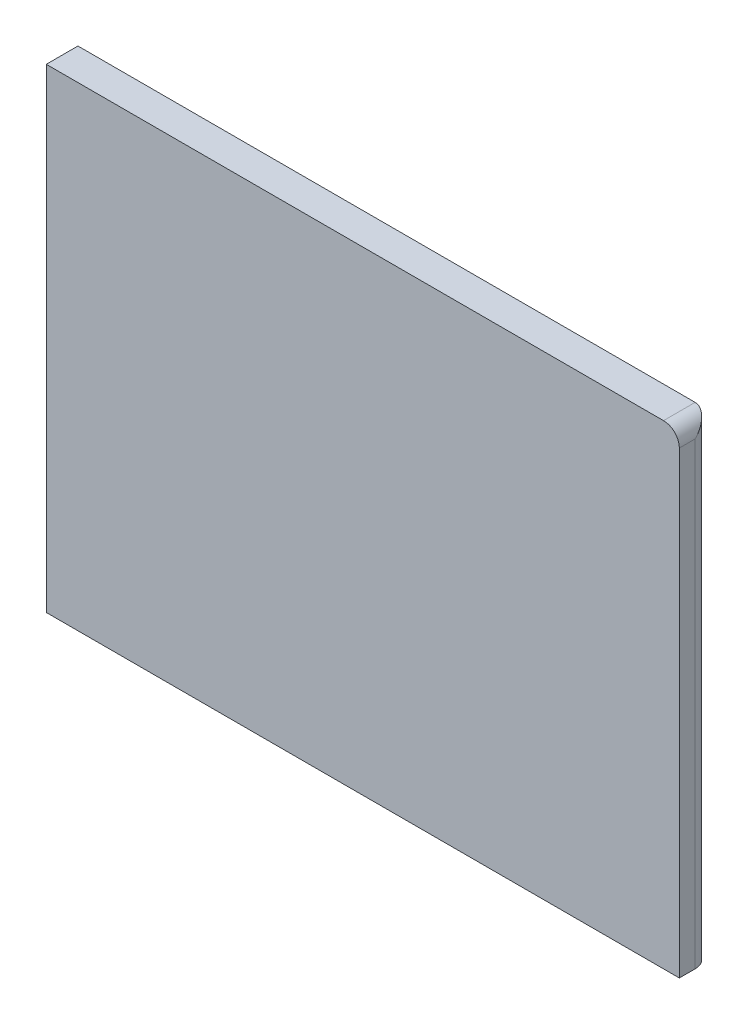
ISO-10303-21;
HEADER;
FILE_DESCRIPTION(('STEP AP214'),'2;1');
FILE_NAME('part.step','',(''),(''),'','','');
FILE_SCHEMA(('AUTOMOTIVE_DESIGN { 1 0 10303 214 1 1 1 1 }'));
ENDSEC;
DATA;
#1=APPLICATION_CONTEXT('core data for automotive mechanical design processes');
#2=APPLICATION_PROTOCOL_DEFINITION('international standard','automotive_design',2000,#1);
#3=PRODUCT_CONTEXT('',#1,'mechanical');
#4=PRODUCT('Part','Part','',(#3));
#5=PRODUCT_RELATED_PRODUCT_CATEGORY('part','',(#4));
#6=PRODUCT_DEFINITION_FORMATION('','',#4);
#7=PRODUCT_DEFINITION_CONTEXT('part definition',#1,'design');
#8=PRODUCT_DEFINITION('design','',#6,#7);
#9=PRODUCT_DEFINITION_SHAPE('','',#8);
#10=(LENGTH_UNIT() NAMED_UNIT(*) SI_UNIT(.MILLI.,.METRE.));
#11=(NAMED_UNIT(*) PLANE_ANGLE_UNIT() SI_UNIT($,.RADIAN.));
#12=(NAMED_UNIT(*) SI_UNIT($,.STERADIAN.) SOLID_ANGLE_UNIT());
#13=UNCERTAINTY_MEASURE_WITH_UNIT(LENGTH_MEASURE(1.E-05),#10,'distance_accuracy_value','');
#14=(GEOMETRIC_REPRESENTATION_CONTEXT(3) GLOBAL_UNCERTAINTY_ASSIGNED_CONTEXT((#13)) GLOBAL_UNIT_ASSIGNED_CONTEXT((#10,
#11,#12)) REPRESENTATION_CONTEXT('',''));
#15=CARTESIAN_POINT('',(0.,0.,0.));
#16=DIRECTION('',(0.,0.,1.));
#17=DIRECTION('',(1.,0.,0.));
#18=AXIS2_PLACEMENT_3D('',#15,#16,#17);
#19=CARTESIAN_POINT('',(80.,0.,-110.));
#20=DIRECTION('',(0.,0.,-1.));
#21=DIRECTION('',(0.,1.,0.));
#22=AXIS2_PLACEMENT_3D('',#19,#20,#21);
#23=PLANE('',#22);
#24=DIRECTION('',(1.,0.,0.));
#25=VECTOR('',#24,1.);
#26=CARTESIAN_POINT('',(0.,78.,-110.));
#27=LINE('',#26,#25);
#28=CARTESIAN_POINT('',(40.,78.,-110.));
#29=VERTEX_POINT('',#28);
#30=CARTESIAN_POINT('',(79.,78.,-110.));
#31=VERTEX_POINT('',#30);
#32=EDGE_CURVE('E72',#29,#31,#27,.T.);
#33=ORIENTED_EDGE('',*,*,#32,.F.);
#34=DIRECTION('',(0.,-1.,0.));
#35=VECTOR('',#34,1.);
#36=CARTESIAN_POINT('',(40.,0.,-110.));
#37=LINE('',#36,#35);
#38=CARTESIAN_POINT('',(40.,108.,-110.));
#39=VERTEX_POINT('',#38);
#40=EDGE_CURVE('E109',#39,#29,#37,.T.);
#41=ORIENTED_EDGE('',*,*,#40,.F.);
#42=DIRECTION('',(-1.,0.,0.));
#43=VECTOR('',#42,1.);
#44=CARTESIAN_POINT('',(80.,108.,-110.));
#45=LINE('',#44,#43);
#46=CARTESIAN_POINT('',(79.,108.,-110.));
#47=VERTEX_POINT('',#46);
#48=EDGE_CURVE('E143',#47,#39,#45,.T.);
#49=ORIENTED_EDGE('',*,*,#48,.F.);
#50=DIRECTION('',(0.,-1.,0.));
#51=VECTOR('',#50,1.);
#52=CARTESIAN_POINT('',(79.,0.,-110.));
#53=LINE('',#52,#51);
#54=EDGE_CURVE('E125',#47,#31,#53,.T.);
#55=ORIENTED_EDGE('',*,*,#54,.T.);
#56=EDGE_LOOP('',(#33,#41,#49,#55));
#57=FACE_BOUND('',#56,.T.);
#58=ADVANCED_FACE('F57',(#57),#23,.T.);
#59=CARTESIAN_POINT('',(80.,108.000000000001,-7.49400541621985E-13));
#60=DIRECTION('',(0.,1.,0.));
#61=DIRECTION('',(0.,0.,1.));
#62=AXIS2_PLACEMENT_3D('',#59,#60,#61);
#63=PLANE('',#62);
#64=ORIENTED_EDGE('',*,*,#48,.T.);
#65=DIRECTION('',(0.,0.,1.));
#66=VECTOR('',#65,1.);
#67=CARTESIAN_POINT('',(40.,108.,-110.));
#68=LINE('',#67,#66);
#69=CARTESIAN_POINT('',(40.,108.,-108.));
#70=VERTEX_POINT('',#69);
#71=EDGE_CURVE('E113',#39,#70,#68,.T.);
#72=ORIENTED_EDGE('',*,*,#71,.T.);
#73=DIRECTION('',(-1.,0.,0.));
#74=VECTOR('',#73,1.);
#75=CARTESIAN_POINT('',(80.,108.,-108.));
#76=LINE('',#75,#74);
#77=CARTESIAN_POINT('',(79.,108.,-108.));
#78=VERTEX_POINT('',#77);
#79=EDGE_CURVE('E141',#78,#70,#76,.T.);
#80=ORIENTED_EDGE('',*,*,#79,.F.);
#81=DIRECTION('',(0.,0.,-1.));
#82=VECTOR('',#81,1.);
#83=CARTESIAN_POINT('',(79.,108.000000000001,-7.49400541621985E-13));
#84=LINE('',#83,#82);
#85=EDGE_CURVE('E151',#78,#47,#84,.T.);
#86=ORIENTED_EDGE('',*,*,#85,.T.);
#87=EDGE_LOOP('',(#64,#72,#80,#86));
#88=FACE_BOUND('',#87,.T.);
#89=ADVANCED_FACE('F165',(#88),#63,.T.);
#90=CARTESIAN_POINT('',(80.,0.,-108.));
#91=DIRECTION('',(0.,0.,1.));
#92=DIRECTION('',(1.,0.,0.));
#93=AXIS2_PLACEMENT_3D('',#90,#91,#92);
#94=PLANE('',#93);
#95=ORIENTED_EDGE('',*,*,#79,.T.);
#96=DIRECTION('',(0.,-1.,0.));
#97=VECTOR('',#96,1.);
#98=CARTESIAN_POINT('',(40.,0.,-108.));
#99=LINE('',#98,#97);
#100=CARTESIAN_POINT('',(40.,78.,-108.));
#101=VERTEX_POINT('',#100);
#102=EDGE_CURVE('E12',#70,#101,#99,.T.);
#103=ORIENTED_EDGE('',*,*,#102,.T.);
#104=DIRECTION('',(1.,0.,0.));
#105=VECTOR('',#104,1.);
#106=CARTESIAN_POINT('',(80.,78.,-108.));
#107=LINE('',#106,#105);
#108=CARTESIAN_POINT('',(80.,78.,-108.));
#109=VERTEX_POINT('',#108);
#110=EDGE_CURVE('E121',#101,#109,#107,.T.);
#111=ORIENTED_EDGE('',*,*,#110,.T.);
#112=DIRECTION('',(0.,1.,0.));
#113=VECTOR('',#112,1.);
#114=CARTESIAN_POINT('',(80.,0.,-108.));
#115=LINE('',#114,#113);
#116=CARTESIAN_POINT('',(80.,107.,-108.));
#117=VERTEX_POINT('',#116);
#118=EDGE_CURVE('E139',#109,#117,#115,.T.);
#119=ORIENTED_EDGE('',*,*,#118,.T.);
#120=CARTESIAN_POINT('',(79.,107.,-108.));
#121=DIRECTION('',(0.,0.,1.));
#122=DIRECTION('',(1.,0.,0.));
#123=AXIS2_PLACEMENT_3D('',#120,#121,#122);
#124=CIRCLE('',#123,1.);
#125=EDGE_CURVE('E80',#117,#78,#124,.T.);
#126=ORIENTED_EDGE('',*,*,#125,.T.);
#127=EDGE_LOOP('',(#95,#103,#111,#119,#126));
#128=FACE_BOUND('',#127,.T.);
#129=ADVANCED_FACE('F163',(#128),#94,.T.);
#130=CARTESIAN_POINT('',(80.,0.,0.));
#131=DIRECTION('',(1.,0.,0.));
#132=DIRECTION('',(0.,0.,-1.));
#133=AXIS2_PLACEMENT_3D('',#130,#131,#132);
#134=PLANE('',#133);
#135=ORIENTED_EDGE('',*,*,#118,.F.);
#136=DIRECTION('',(0.,0.,1.));
#137=VECTOR('',#136,1.);
#138=CARTESIAN_POINT('',(80.,78.,-110.));
#139=LINE('',#138,#137);
#140=CARTESIAN_POINT('',(80.,78.,-109.));
#141=VERTEX_POINT('',#140);
#142=EDGE_CURVE('E117',#141,#109,#139,.T.);
#143=ORIENTED_EDGE('',*,*,#142,.F.);
#144=DIRECTION('',(0.,-1.,0.));
#145=VECTOR('',#144,1.);
#146=CARTESIAN_POINT('',(80.,0.,-109.));
#147=LINE('',#146,#145);
#148=CARTESIAN_POINT('',(80.,107.,-109.));
#149=VERTEX_POINT('',#148);
#150=EDGE_CURVE('E149',#141,#149,#147,.F.);
#151=ORIENTED_EDGE('',*,*,#150,.T.);
#152=DIRECTION('',(0.,0.,-1.));
#153=VECTOR('',#152,1.);
#154=CARTESIAN_POINT('',(80.,107.000000000001,-7.42461647718078E-13));
#155=LINE('',#154,#153);
#156=EDGE_CURVE('E146',#149,#117,#155,.F.);
#157=ORIENTED_EDGE('',*,*,#156,.T.);
#158=EDGE_LOOP('',(#135,#143,#151,#157));
#159=FACE_BOUND('',#158,.T.);
#160=ADVANCED_FACE('F161',(#159),#134,.T.);
#161=CARTESIAN_POINT('',(79.,0.,-109.));
#162=DIRECTION('',(0.,-1.,0.));
#163=DIRECTION('',(0.,0.,-1.));
#164=AXIS2_PLACEMENT_3D('',#161,#162,#163);
#165=CYLINDRICAL_SURFACE('',#164,1.);
#166=ORIENTED_EDGE('',*,*,#150,.F.);
#167=CARTESIAN_POINT('',(79.,78.,-109.));
#168=DIRECTION('',(0.,-1.,0.));
#169=DIRECTION('',(0.,0.,-1.));
#170=AXIS2_PLACEMENT_3D('',#167,#168,#169);
#171=CIRCLE('',#170,1.);
#172=EDGE_CURVE('E65',#141,#31,#171,.F.);
#173=ORIENTED_EDGE('',*,*,#172,.T.);
#174=ORIENTED_EDGE('',*,*,#54,.F.);
#175=CARTESIAN_POINT('',(79.,107.,-109.));
#176=DIRECTION('',(0.,-0.70710678118655,-0.707106781186545));
#177=DIRECTION('',(0.,0.707106781186545,-0.70710678118655));
#178=AXIS2_PLACEMENT_3D('',#175,#176,#177);
#179=ELLIPSE('',#178,1.41421356237309,1.);
#180=EDGE_CURVE('E138',#47,#149,#179,.T.);
#181=ORIENTED_EDGE('',*,*,#180,.T.);
#182=EDGE_LOOP('',(#166,#173,#174,#181));
#183=FACE_BOUND('',#182,.T.);
#184=ADVANCED_FACE('F157',(#183),#165,.T.);
#185=CARTESIAN_POINT('',(79.,107.000000000001,-7.42461647718078E-13));
#186=DIRECTION('',(0.,0.,-1.));
#187=DIRECTION('',(0.,1.,0.));
#188=AXIS2_PLACEMENT_3D('',#185,#186,#187);
#189=CYLINDRICAL_SURFACE('',#188,1.);
#190=ORIENTED_EDGE('',*,*,#125,.F.);
#191=ORIENTED_EDGE('',*,*,#156,.F.);
#192=ORIENTED_EDGE('',*,*,#180,.F.);
#193=ORIENTED_EDGE('',*,*,#85,.F.);
#194=EDGE_LOOP('',(#190,#191,#192,#193));
#195=FACE_BOUND('',#194,.T.);
#196=ADVANCED_FACE('F59',(#195),#189,.T.);
#197=CARTESIAN_POINT('',(40.,0.,-110.));
#198=DIRECTION('',(-1.,0.,0.));
#199=DIRECTION('',(0.,-1.,0.));
#200=AXIS2_PLACEMENT_3D('',#197,#198,#199);
#201=PLANE('',#200);
#202=CARTESIAN_POINT('',(40.,98.,-109.));
#203=DIRECTION('',(-1.,0.,0.));
#204=DIRECTION('',(0.,0.,1.));
#205=AXIS2_PLACEMENT_3D('',#202,#203,#204);
#206=CIRCLE('',#205,0.749999999999999);
#207=CARTESIAN_POINT('',(40.,98.,-108.25));
#208=VERTEX_POINT('',#207);
#209=EDGE_CURVE('E129',#208,#208,#206,.T.);
#210=ORIENTED_EDGE('',*,*,#209,.F.);
#211=EDGE_LOOP('',(#210));
#212=FACE_BOUND('',#211,.T.);
#213=CARTESIAN_POINT('',(40.,88.,-109.));
#214=DIRECTION('',(-1.,0.,0.));
#215=DIRECTION('',(0.,0.,1.));
#216=AXIS2_PLACEMENT_3D('',#213,#214,#215);
#217=CIRCLE('',#216,0.749999999999999);
#218=CARTESIAN_POINT('',(40.,88.,-108.25));
#219=VERTEX_POINT('',#218);
#220=EDGE_CURVE('E229',#219,#219,#217,.T.);
#221=ORIENTED_EDGE('',*,*,#220,.F.);
#222=EDGE_LOOP('',(#221));
#223=FACE_BOUND('',#222,.T.);
#224=ORIENTED_EDGE('',*,*,#71,.F.);
#225=ORIENTED_EDGE('',*,*,#40,.T.);
#226=DIRECTION('',(0.,0.,1.));
#227=VECTOR('',#226,1.);
#228=CARTESIAN_POINT('',(40.,78.,-110.));
#229=LINE('',#228,#227);
#230=EDGE_CURVE('E111',#29,#101,#229,.T.);
#231=ORIENTED_EDGE('',*,*,#230,.T.);
#232=ORIENTED_EDGE('',*,*,#102,.F.);
#233=EDGE_LOOP('',(#224,#225,#231,#232));
#234=FACE_BOUND('',#233,.T.);
#235=ADVANCED_FACE('F110',(#212,#223,#234),#201,.T.);
#236=CARTESIAN_POINT('',(0.,78.,-110.));
#237=DIRECTION('',(0.,-1.,0.));
#238=DIRECTION('',(0.,0.,-1.));
#239=AXIS2_PLACEMENT_3D('',#236,#237,#238);
#240=PLANE('',#239);
#241=CARTESIAN_POINT('',(70.,78.,-109.));
#242=DIRECTION('',(0.,-1.,0.));
#243=DIRECTION('',(0.,0.,-1.));
#244=AXIS2_PLACEMENT_3D('',#241,#242,#243);
#245=CIRCLE('',#244,0.749999999999999);
#246=CARTESIAN_POINT('',(70.,78.,-109.75));
#247=VERTEX_POINT('',#246);
#248=EDGE_CURVE('E226',#247,#247,#245,.T.);
#249=ORIENTED_EDGE('',*,*,#248,.F.);
#250=EDGE_LOOP('',(#249));
#251=FACE_BOUND('',#250,.T.);
#252=CARTESIAN_POINT('',(50.,78.,-109.));
#253=DIRECTION('',(0.,-1.,0.));
#254=DIRECTION('',(0.,0.,-1.));
#255=AXIS2_PLACEMENT_3D('',#252,#253,#254);
#256=CIRCLE('',#255,0.749999999999999);
#257=CARTESIAN_POINT('',(50.,78.,-109.75));
#258=VERTEX_POINT('',#257);
#259=EDGE_CURVE('E231',#258,#258,#256,.T.);
#260=ORIENTED_EDGE('',*,*,#259,.F.);
#261=EDGE_LOOP('',(#260));
#262=FACE_BOUND('',#261,.T.);
#263=ORIENTED_EDGE('',*,*,#230,.F.);
#264=ORIENTED_EDGE('',*,*,#32,.T.);
#265=ORIENTED_EDGE('',*,*,#172,.F.);
#266=ORIENTED_EDGE('',*,*,#142,.T.);
#267=ORIENTED_EDGE('',*,*,#110,.F.);
#268=EDGE_LOOP('',(#263,#264,#265,#266,#267));
#269=FACE_BOUND('',#268,.T.);
#270=ADVANCED_FACE('F119',(#251,#262,#269),#240,.T.);
#271=CARTESIAN_POINT('',(45.,88.,-109.));
#272=DIRECTION('',(-1.,0.,0.));
#273=DIRECTION('',(0.,0.,1.));
#274=AXIS2_PLACEMENT_3D('',#271,#272,#273);
#275=CYLINDRICAL_SURFACE('',#274,0.749999999999999);
#276=ORIENTED_EDGE('',*,*,#220,.T.);
#277=EDGE_LOOP('',(#276));
#278=FACE_BOUND('',#277,.T.);
#279=CARTESIAN_POINT('',(45.,88.,-109.));
#280=DIRECTION('',(-1.,0.,0.));
#281=DIRECTION('',(0.,0.,1.));
#282=AXIS2_PLACEMENT_3D('',#279,#280,#281);
#283=CIRCLE('',#282,0.749999999999999);
#284=CARTESIAN_POINT('',(45.,88.,-108.25));
#285=VERTEX_POINT('',#284);
#286=EDGE_CURVE('E132',#285,#285,#283,.T.);
#287=ORIENTED_EDGE('',*,*,#286,.F.);
#288=EDGE_LOOP('',(#287));
#289=FACE_BOUND('',#288,.T.);
#290=ADVANCED_FACE('F188',(#278,#289),#275,.F.);
#291=CARTESIAN_POINT('',(45.,0.,0.));
#292=DIRECTION('',(-1.,0.,0.));
#293=DIRECTION('',(0.,0.,1.));
#294=AXIS2_PLACEMENT_3D('',#291,#292,#293);
#295=PLANE('',#294);
#296=ORIENTED_EDGE('',*,*,#286,.T.);
#297=EDGE_LOOP('',(#296));
#298=FACE_BOUND('',#297,.T.);
#299=ADVANCED_FACE('F191',(#298),#295,.T.);
#300=CARTESIAN_POINT('',(45.,98.,-109.));
#301=DIRECTION('',(-1.,0.,0.));
#302=DIRECTION('',(0.,0.,1.));
#303=AXIS2_PLACEMENT_3D('',#300,#301,#302);
#304=CYLINDRICAL_SURFACE('',#303,0.749999999999999);
#305=CARTESIAN_POINT('',(45.,98.,-109.));
#306=DIRECTION('',(-1.,0.,0.));
#307=DIRECTION('',(0.,0.,1.));
#308=AXIS2_PLACEMENT_3D('',#305,#306,#307);
#309=CIRCLE('',#308,0.749999999999999);
#310=CARTESIAN_POINT('',(45.,98.,-108.25));
#311=VERTEX_POINT('',#310);
#312=EDGE_CURVE('E126',#311,#311,#309,.T.);
#313=ORIENTED_EDGE('',*,*,#312,.F.);
#314=EDGE_LOOP('',(#313));
#315=FACE_BOUND('',#314,.T.);
#316=ORIENTED_EDGE('',*,*,#209,.T.);
#317=EDGE_LOOP('',(#316));
#318=FACE_BOUND('',#317,.T.);
#319=ADVANCED_FACE('F194',(#315,#318),#304,.F.);
#320=CARTESIAN_POINT('',(45.,0.,0.));
#321=DIRECTION('',(-1.,0.,0.));
#322=DIRECTION('',(0.,0.,1.));
#323=AXIS2_PLACEMENT_3D('',#320,#321,#322);
#324=PLANE('',#323);
#325=ORIENTED_EDGE('',*,*,#312,.T.);
#326=EDGE_LOOP('',(#325));
#327=FACE_BOUND('',#326,.T.);
#328=ADVANCED_FACE('F201',(#327),#324,.T.);
#329=CARTESIAN_POINT('',(50.,83.,-109.));
#330=DIRECTION('',(0.,-1.,0.));
#331=DIRECTION('',(0.,0.,-1.));
#332=AXIS2_PLACEMENT_3D('',#329,#330,#331);
#333=CYLINDRICAL_SURFACE('',#332,0.749999999999999);
#334=ORIENTED_EDGE('',*,*,#259,.T.);
#335=EDGE_LOOP('',(#334));
#336=FACE_BOUND('',#335,.T.);
#337=CARTESIAN_POINT('',(50.,83.,-109.));
#338=DIRECTION('',(0.,-1.,0.));
#339=DIRECTION('',(0.,0.,-1.));
#340=AXIS2_PLACEMENT_3D('',#337,#338,#339);
#341=CIRCLE('',#340,0.749999999999999);
#342=CARTESIAN_POINT('',(50.,83.,-109.75));
#343=VERTEX_POINT('',#342);
#344=EDGE_CURVE('E236',#343,#343,#341,.T.);
#345=ORIENTED_EDGE('',*,*,#344,.F.);
#346=EDGE_LOOP('',(#345));
#347=FACE_BOUND('',#346,.T.);
#348=ADVANCED_FACE('F205',(#336,#347),#333,.F.);
#349=CARTESIAN_POINT('',(0.,83.,0.));
#350=DIRECTION('',(0.,-1.,0.));
#351=DIRECTION('',(0.,0.,-1.));
#352=AXIS2_PLACEMENT_3D('',#349,#350,#351);
#353=PLANE('',#352);
#354=ORIENTED_EDGE('',*,*,#344,.T.);
#355=EDGE_LOOP('',(#354));
#356=FACE_BOUND('',#355,.T.);
#357=ADVANCED_FACE('F207',(#356),#353,.T.);
#358=CARTESIAN_POINT('',(70.,83.,-109.));
#359=DIRECTION('',(0.,-1.,0.));
#360=DIRECTION('',(0.,0.,-1.));
#361=AXIS2_PLACEMENT_3D('',#358,#359,#360);
#362=CYLINDRICAL_SURFACE('',#361,0.749999999999999);
#363=CARTESIAN_POINT('',(70.,83.,-109.));
#364=DIRECTION('',(0.,-1.,0.));
#365=DIRECTION('',(0.,0.,-1.));
#366=AXIS2_PLACEMENT_3D('',#363,#364,#365);
#367=CIRCLE('',#366,0.749999999999999);
#368=CARTESIAN_POINT('',(70.,83.,-109.75));
#369=VERTEX_POINT('',#368);
#370=EDGE_CURVE('E225',#369,#369,#367,.T.);
#371=ORIENTED_EDGE('',*,*,#370,.F.);
#372=EDGE_LOOP('',(#371));
#373=FACE_BOUND('',#372,.T.);
#374=ORIENTED_EDGE('',*,*,#248,.T.);
#375=EDGE_LOOP('',(#374));
#376=FACE_BOUND('',#375,.T.);
#377=ADVANCED_FACE('F210',(#373,#376),#362,.F.);
#378=CARTESIAN_POINT('',(0.,83.,0.));
#379=DIRECTION('',(0.,-1.,0.));
#380=DIRECTION('',(0.,0.,-1.));
#381=AXIS2_PLACEMENT_3D('',#378,#379,#380);
#382=PLANE('',#381);
#383=ORIENTED_EDGE('',*,*,#370,.T.);
#384=EDGE_LOOP('',(#383));
#385=FACE_BOUND('',#384,.T.);
#386=ADVANCED_FACE('F217',(#385),#382,.T.);
#387=CLOSED_SHELL('',(#58,#89,#129,#160,#184,#196,#235,#270,#290,#299,#319,#328,#348,#357,#377,#386));
#388=MANIFOLD_SOLID_BREP('B2',#387);
#389=ADVANCED_BREP_SHAPE_REPRESENTATION('',(#18,#388),#14);
#390=SHAPE_DEFINITION_REPRESENTATION(#9,#389);
ENDSEC;
END-ISO-10303-21;
